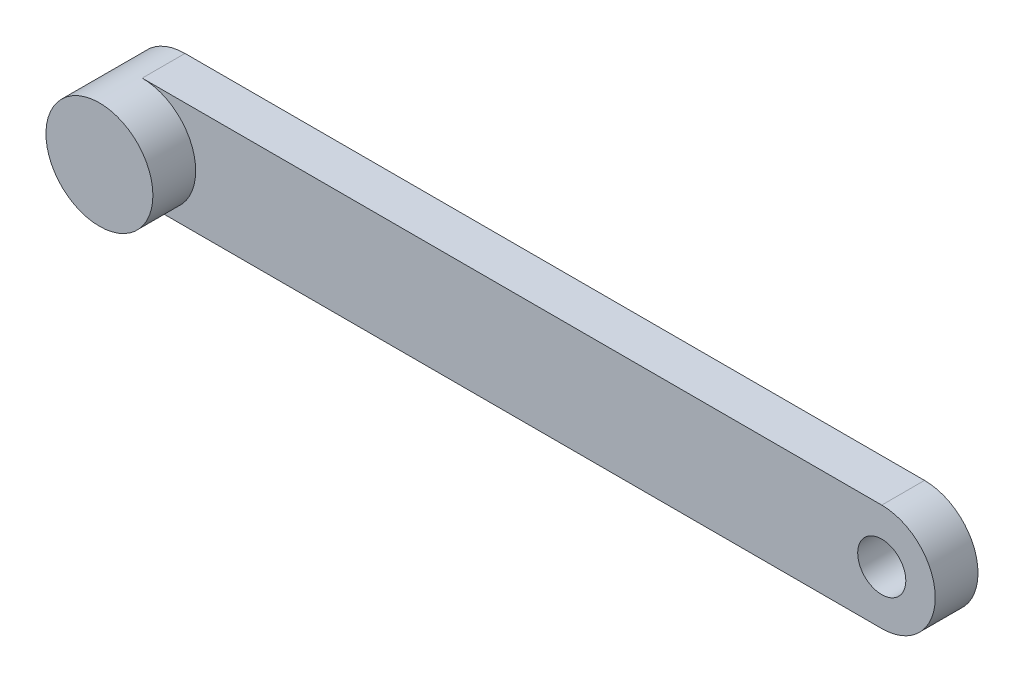
ISO-10303-21;
HEADER;
FILE_DESCRIPTION(('STEP AP214'),'2;1');
FILE_NAME('part.step','',(''),(''),'','','');
FILE_SCHEMA(('AUTOMOTIVE_DESIGN { 1 0 10303 214 1 1 1 1 }'));
ENDSEC;
DATA;
#1=APPLICATION_CONTEXT('core data for automotive mechanical design processes');
#2=APPLICATION_PROTOCOL_DEFINITION('international standard','automotive_design',2000,#1);
#3=PRODUCT_CONTEXT('',#1,'mechanical');
#4=PRODUCT('Part','Part','',(#3));
#5=PRODUCT_RELATED_PRODUCT_CATEGORY('part','',(#4));
#6=PRODUCT_DEFINITION_FORMATION('','',#4);
#7=PRODUCT_DEFINITION_CONTEXT('part definition',#1,'design');
#8=PRODUCT_DEFINITION('design','',#6,#7);
#9=PRODUCT_DEFINITION_SHAPE('','',#8);
#10=(LENGTH_UNIT() NAMED_UNIT(*) SI_UNIT(.MILLI.,.METRE.));
#11=(NAMED_UNIT(*) PLANE_ANGLE_UNIT() SI_UNIT($,.RADIAN.));
#12=(NAMED_UNIT(*) SI_UNIT($,.STERADIAN.) SOLID_ANGLE_UNIT());
#13=UNCERTAINTY_MEASURE_WITH_UNIT(LENGTH_MEASURE(1.E-05),#10,'distance_accuracy_value','');
#14=(GEOMETRIC_REPRESENTATION_CONTEXT(3) GLOBAL_UNCERTAINTY_ASSIGNED_CONTEXT((#13)) GLOBAL_UNIT_ASSIGNED_CONTEXT((#10,
#11,#12)) REPRESENTATION_CONTEXT('',''));
#15=CARTESIAN_POINT('',(0.,0.,0.));
#16=DIRECTION('',(0.,0.,1.));
#17=DIRECTION('',(1.,0.,0.));
#18=AXIS2_PLACEMENT_3D('',#15,#16,#17);
#19=CARTESIAN_POINT('',(0.,0.,2.));
#20=DIRECTION('',(0.,0.,-1.));
#21=DIRECTION('',(-1.,0.,0.));
#22=AXIS2_PLACEMENT_3D('',#19,#20,#21);
#23=CYLINDRICAL_SURFACE('',#22,5.);
#24=CARTESIAN_POINT('',(0.,0.,-2.));
#25=DIRECTION('',(0.,0.,1.));
#26=DIRECTION('',(1.,0.,0.));
#27=AXIS2_PLACEMENT_3D('',#24,#25,#26);
#28=CIRCLE('',#27,5.);
#29=CARTESIAN_POINT('',(0.,5.,-2.));
#30=VERTEX_POINT('',#29);
#31=CARTESIAN_POINT('',(0.,-5.,-2.));
#32=VERTEX_POINT('',#31);
#33=EDGE_CURVE('E88',#30,#32,#28,.T.);
#34=ORIENTED_EDGE('',*,*,#33,.T.);
#35=DIRECTION('',(0.,0.,-1.));
#36=VECTOR('',#35,1.);
#37=CARTESIAN_POINT('',(0.,-5.,2.));
#38=LINE('',#37,#36);
#39=CARTESIAN_POINT('',(0.,-5.,2.));
#40=VERTEX_POINT('',#39);
#41=EDGE_CURVE('E11',#40,#32,#38,.T.);
#42=ORIENTED_EDGE('',*,*,#41,.F.);
#43=CARTESIAN_POINT('',(0.,0.,2.));
#44=DIRECTION('',(0.,0.,1.));
#45=DIRECTION('',(1.,0.,0.));
#46=AXIS2_PLACEMENT_3D('',#43,#44,#45);
#47=CIRCLE('',#46,5.);
#48=CARTESIAN_POINT('',(0.,5.,2.));
#49=VERTEX_POINT('',#48);
#50=EDGE_CURVE('E79',#49,#40,#47,.F.);
#51=ORIENTED_EDGE('',*,*,#50,.F.);
#52=DIRECTION('',(0.,0.,-1.));
#53=VECTOR('',#52,1.);
#54=CARTESIAN_POINT('',(0.,5.,2.));
#55=LINE('',#54,#53);
#56=EDGE_CURVE('E86',#49,#30,#55,.T.);
#57=ORIENTED_EDGE('',*,*,#56,.T.);
#58=EDGE_LOOP('',(#34,#42,#51,#57));
#59=FACE_BOUND('',#58,.T.);
#60=CARTESIAN_POINT('',(0.,0.,6.));
#61=DIRECTION('',(0.,0.,1.));
#62=DIRECTION('',(1.,0.,0.));
#63=AXIS2_PLACEMENT_3D('',#60,#61,#62);
#64=CIRCLE('',#63,5.);
#65=CARTESIAN_POINT('',(5.,0.,6.));
#66=VERTEX_POINT('',#65);
#67=EDGE_CURVE('E89',#66,#66,#64,.T.);
#68=ORIENTED_EDGE('',*,*,#67,.F.);
#69=EDGE_LOOP('',(#68));
#70=FACE_BOUND('',#69,.T.);
#71=ADVANCED_FACE('F36',(#59,#70),#23,.T.);
#72=CARTESIAN_POINT('',(0.,-5.,2.));
#73=DIRECTION('',(0.,1.,0.));
#74=DIRECTION('',(0.,0.,1.));
#75=AXIS2_PLACEMENT_3D('',#72,#73,#74);
#76=PLANE('',#75);
#77=DIRECTION('',(1.,0.,0.));
#78=VECTOR('',#77,1.);
#79=CARTESIAN_POINT('',(0.,-5.,-2.));
#80=LINE('',#79,#78);
#81=CARTESIAN_POINT('',(69.15,-5.,-2.));
#82=VERTEX_POINT('',#81);
#83=EDGE_CURVE('E106',#32,#82,#80,.T.);
#84=ORIENTED_EDGE('',*,*,#83,.T.);
#85=DIRECTION('',(0.,0.,-1.));
#86=VECTOR('',#85,1.);
#87=CARTESIAN_POINT('',(69.15,-5.,2.));
#88=LINE('',#87,#86);
#89=CARTESIAN_POINT('',(69.15,-5.,2.));
#90=VERTEX_POINT('',#89);
#91=EDGE_CURVE('E44',#90,#82,#88,.T.);
#92=ORIENTED_EDGE('',*,*,#91,.F.);
#93=DIRECTION('',(1.,0.,0.));
#94=VECTOR('',#93,1.);
#95=CARTESIAN_POINT('',(0.,-5.,2.));
#96=LINE('',#95,#94);
#97=EDGE_CURVE('E107',#40,#90,#96,.T.);
#98=ORIENTED_EDGE('',*,*,#97,.F.);
#99=ORIENTED_EDGE('',*,*,#41,.T.);
#100=EDGE_LOOP('',(#84,#92,#98,#99));
#101=FACE_BOUND('',#100,.T.);
#102=ADVANCED_FACE('F137',(#101),#76,.F.);
#103=CARTESIAN_POINT('',(69.15,0.,2.));
#104=DIRECTION('',(0.,0.,-1.));
#105=DIRECTION('',(-1.,0.,0.));
#106=AXIS2_PLACEMENT_3D('',#103,#104,#105);
#107=CYLINDRICAL_SURFACE('',#106,5.);
#108=CARTESIAN_POINT('',(69.15,0.,-2.));
#109=DIRECTION('',(0.,0.,1.));
#110=DIRECTION('',(1.,0.,0.));
#111=AXIS2_PLACEMENT_3D('',#108,#109,#110);
#112=CIRCLE('',#111,5.);
#113=CARTESIAN_POINT('',(69.15,5.,-2.));
#114=VERTEX_POINT('',#113);
#115=EDGE_CURVE('E69',#82,#114,#112,.T.);
#116=ORIENTED_EDGE('',*,*,#115,.T.);
#117=DIRECTION('',(0.,0.,-1.));
#118=VECTOR('',#117,1.);
#119=CARTESIAN_POINT('',(69.15,5.,2.));
#120=LINE('',#119,#118);
#121=CARTESIAN_POINT('',(69.15,5.,2.));
#122=VERTEX_POINT('',#121);
#123=EDGE_CURVE('E96',#122,#114,#120,.T.);
#124=ORIENTED_EDGE('',*,*,#123,.F.);
#125=CARTESIAN_POINT('',(69.15,0.,2.));
#126=DIRECTION('',(0.,0.,1.));
#127=DIRECTION('',(1.,0.,0.));
#128=AXIS2_PLACEMENT_3D('',#125,#126,#127);
#129=CIRCLE('',#128,5.);
#130=EDGE_CURVE('E52',#90,#122,#129,.T.);
#131=ORIENTED_EDGE('',*,*,#130,.F.);
#132=ORIENTED_EDGE('',*,*,#91,.T.);
#133=EDGE_LOOP('',(#116,#124,#131,#132));
#134=FACE_BOUND('',#133,.T.);
#135=ADVANCED_FACE('F102',(#134),#107,.T.);
#136=CARTESIAN_POINT('',(0.,5.,2.));
#137=DIRECTION('',(0.,-1.,0.));
#138=DIRECTION('',(0.,0.,-1.));
#139=AXIS2_PLACEMENT_3D('',#136,#137,#138);
#140=PLANE('',#139);
#141=DIRECTION('',(-1.,0.,0.));
#142=VECTOR('',#141,1.);
#143=CARTESIAN_POINT('',(0.,5.,-2.));
#144=LINE('',#143,#142);
#145=EDGE_CURVE('E75',#114,#30,#144,.T.);
#146=ORIENTED_EDGE('',*,*,#145,.T.);
#147=ORIENTED_EDGE('',*,*,#56,.F.);
#148=DIRECTION('',(-1.,0.,0.));
#149=VECTOR('',#148,1.);
#150=CARTESIAN_POINT('',(0.,5.,2.));
#151=LINE('',#150,#149);
#152=EDGE_CURVE('E92',#122,#49,#151,.T.);
#153=ORIENTED_EDGE('',*,*,#152,.F.);
#154=ORIENTED_EDGE('',*,*,#123,.T.);
#155=EDGE_LOOP('',(#146,#147,#153,#154));
#156=FACE_BOUND('',#155,.T.);
#157=ADVANCED_FACE('F95',(#156),#140,.F.);
#158=CARTESIAN_POINT('',(0.,0.,2.));
#159=DIRECTION('',(0.,0.,1.));
#160=DIRECTION('',(1.,0.,0.));
#161=AXIS2_PLACEMENT_3D('',#158,#159,#160);
#162=PLANE('',#161);
#163=CARTESIAN_POINT('',(69.15,0.,2.));
#164=DIRECTION('',(0.,0.,1.));
#165=DIRECTION('',(1.,0.,0.));
#166=AXIS2_PLACEMENT_3D('',#163,#164,#165);
#167=CIRCLE('',#166,2.25);
#168=CARTESIAN_POINT('',(71.4,0.,2.));
#169=VERTEX_POINT('',#168);
#170=EDGE_CURVE('E115',#169,#169,#167,.T.);
#171=ORIENTED_EDGE('',*,*,#170,.F.);
#172=EDGE_LOOP('',(#171));
#173=FACE_BOUND('',#172,.T.);
#174=ORIENTED_EDGE('',*,*,#152,.T.);
#175=ORIENTED_EDGE('',*,*,#50,.T.);
#176=ORIENTED_EDGE('',*,*,#97,.T.);
#177=ORIENTED_EDGE('',*,*,#130,.T.);
#178=EDGE_LOOP('',(#174,#175,#176,#177));
#179=FACE_BOUND('',#178,.T.);
#180=ADVANCED_FACE('F93',(#173,#179),#162,.T.);
#181=CARTESIAN_POINT('',(0.,0.,-2.));
#182=DIRECTION('',(0.,0.,1.));
#183=DIRECTION('',(1.,0.,0.));
#184=AXIS2_PLACEMENT_3D('',#181,#182,#183);
#185=PLANE('',#184);
#186=CARTESIAN_POINT('',(69.15,0.,-2.));
#187=DIRECTION('',(0.,0.,-1.));
#188=DIRECTION('',(-1.,0.,0.));
#189=AXIS2_PLACEMENT_3D('',#186,#187,#188);
#190=CIRCLE('',#189,2.25);
#191=CARTESIAN_POINT('',(66.9,0.,-2.));
#192=VERTEX_POINT('',#191);
#193=EDGE_CURVE('E118',#192,#192,#190,.T.);
#194=ORIENTED_EDGE('',*,*,#193,.F.);
#195=EDGE_LOOP('',(#194));
#196=FACE_BOUND('',#195,.T.);
#197=ORIENTED_EDGE('',*,*,#83,.F.);
#198=ORIENTED_EDGE('',*,*,#33,.F.);
#199=ORIENTED_EDGE('',*,*,#145,.F.);
#200=ORIENTED_EDGE('',*,*,#115,.F.);
#201=EDGE_LOOP('',(#197,#198,#199,#200));
#202=FACE_BOUND('',#201,.T.);
#203=ADVANCED_FACE('F105',(#196,#202),#185,.F.);
#204=CARTESIAN_POINT('',(0.,0.,6.));
#205=DIRECTION('',(0.,0.,1.));
#206=DIRECTION('',(1.,0.,0.));
#207=AXIS2_PLACEMENT_3D('',#204,#205,#206);
#208=PLANE('',#207);
#209=ORIENTED_EDGE('',*,*,#67,.T.);
#210=EDGE_LOOP('',(#209));
#211=FACE_BOUND('',#210,.T.);
#212=ADVANCED_FACE('F125',(#211),#208,.T.);
#213=CARTESIAN_POINT('',(69.15,0.,-2.));
#214=DIRECTION('',(0.,0.,-1.));
#215=DIRECTION('',(-1.,0.,0.));
#216=AXIS2_PLACEMENT_3D('',#213,#214,#215);
#217=CYLINDRICAL_SURFACE('',#216,2.25);
#218=ORIENTED_EDGE('',*,*,#170,.T.);
#219=EDGE_LOOP('',(#218));
#220=FACE_BOUND('',#219,.T.);
#221=ORIENTED_EDGE('',*,*,#193,.T.);
#222=EDGE_LOOP('',(#221));
#223=FACE_BOUND('',#222,.T.);
#224=ADVANCED_FACE('F122',(#220,#223),#217,.F.);
#225=CLOSED_SHELL('',(#71,#102,#135,#157,#180,#203,#212,#224));
#226=MANIFOLD_SOLID_BREP('B2',#225);
#227=ADVANCED_BREP_SHAPE_REPRESENTATION('',(#18,#226),#14);
#228=SHAPE_DEFINITION_REPRESENTATION(#9,#227);
ENDSEC;
END-ISO-10303-21;
